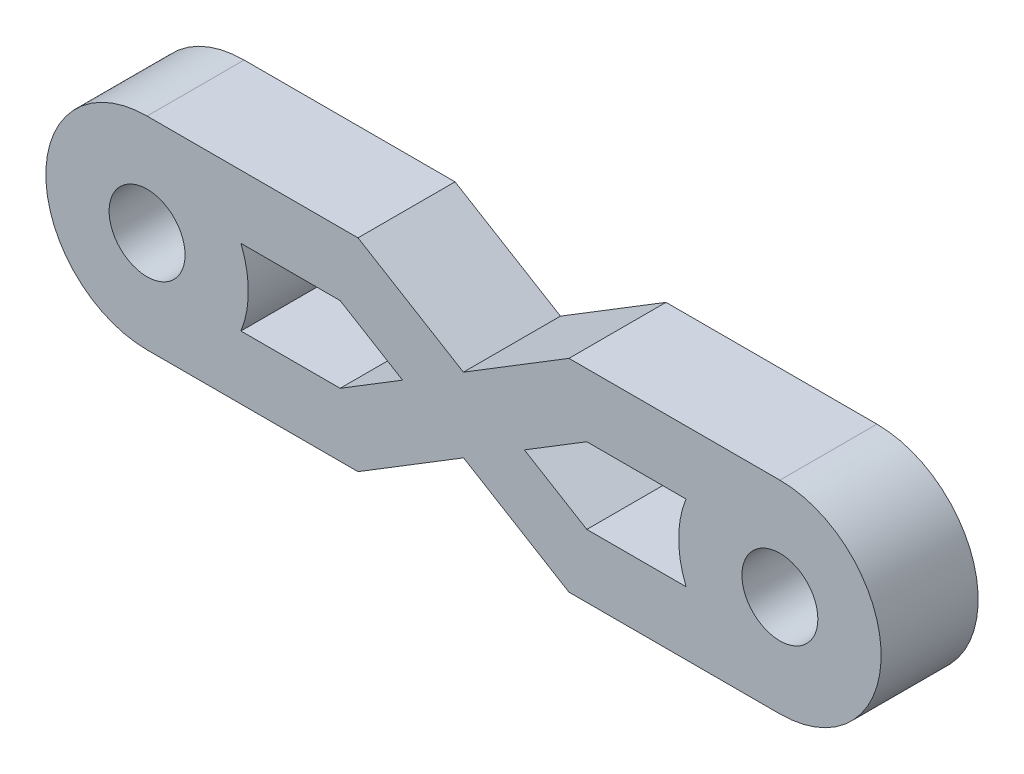
ISO-10303-21;
HEADER;
FILE_DESCRIPTION(('STEP AP214'),'2;1');
FILE_NAME('part.step','',(''),(''),'','','');
FILE_SCHEMA(('AUTOMOTIVE_DESIGN { 1 0 10303 214 1 1 1 1 }'));
ENDSEC;
DATA;
#1=APPLICATION_CONTEXT('core data for automotive mechanical design processes');
#2=APPLICATION_PROTOCOL_DEFINITION('international standard','automotive_design',2000,#1);
#3=PRODUCT_CONTEXT('',#1,'mechanical');
#4=PRODUCT('Part','Part','',(#3));
#5=PRODUCT_RELATED_PRODUCT_CATEGORY('part','',(#4));
#6=PRODUCT_DEFINITION_FORMATION('','',#4);
#7=PRODUCT_DEFINITION_CONTEXT('part definition',#1,'design');
#8=PRODUCT_DEFINITION('design','',#6,#7);
#9=PRODUCT_DEFINITION_SHAPE('','',#8);
#10=(LENGTH_UNIT() NAMED_UNIT(*) SI_UNIT(.MILLI.,.METRE.));
#11=(NAMED_UNIT(*) PLANE_ANGLE_UNIT() SI_UNIT($,.RADIAN.));
#12=(NAMED_UNIT(*) SI_UNIT($,.STERADIAN.) SOLID_ANGLE_UNIT());
#13=UNCERTAINTY_MEASURE_WITH_UNIT(LENGTH_MEASURE(1.E-05),#10,'distance_accuracy_value','');
#14=(GEOMETRIC_REPRESENTATION_CONTEXT(3) GLOBAL_UNCERTAINTY_ASSIGNED_CONTEXT((#13)) GLOBAL_UNIT_ASSIGNED_CONTEXT((#10,
#11,#12)) REPRESENTATION_CONTEXT('',''));
#15=CARTESIAN_POINT('',(0.,0.,0.));
#16=DIRECTION('',(0.,0.,1.));
#17=DIRECTION('',(1.,0.,0.));
#18=AXIS2_PLACEMENT_3D('',#15,#16,#17);
#19=CARTESIAN_POINT('',(-117.224103079449,-0.0523282381606968,45.3592960120693));
#20=DIRECTION('',(0.,0.,-1.));
#21=DIRECTION('',(-1.,0.,0.));
#22=AXIS2_PLACEMENT_3D('',#19,#20,#21);
#23=CYLINDRICAL_SURFACE('',#22,4.79999999999999);
#24=CARTESIAN_POINT('',(-117.224103079449,-0.0523282381606968,4.5999999995309));
#25=DIRECTION('',(2.71474370928103E-13,3.35516105467142E-13,1.));
#26=DIRECTION('',(0.,-1.,3.35516105467142E-13));
#27=AXIS2_PLACEMENT_3D('',#24,#25,#26);
#28=CIRCLE('',#27,4.79999999999999);
#29=CARTESIAN_POINT('',(-112.774383987193,-1.85232823816272,4.59999999953029));
#30=VERTEX_POINT('',#29);
#31=CARTESIAN_POINT('',(-112.774383987192,1.74767176183929,4.59999999952909));
#32=VERTEX_POINT('',#31);
#33=EDGE_CURVE('E223',#30,#32,#28,.T.);
#34=ORIENTED_EDGE('',*,*,#33,.F.);
#35=DIRECTION('',(0.,0.,-1.));
#36=VECTOR('',#35,1.);
#37=CARTESIAN_POINT('',(-112.774383987193,-1.8523282381628,45.3592960120693));
#38=LINE('',#37,#36);
#39=CARTESIAN_POINT('',(-112.774383987193,-1.8523282381628,0.));
#40=VERTEX_POINT('',#39);
#41=EDGE_CURVE('E186',#30,#40,#38,.T.);
#42=ORIENTED_EDGE('',*,*,#41,.T.);
#43=CARTESIAN_POINT('',(-117.224103079449,-0.0523282381606968,0.));
#44=DIRECTION('',(0.,0.,1.));
#45=DIRECTION('',(1.,0.,0.));
#46=AXIS2_PLACEMENT_3D('',#43,#44,#45);
#47=CIRCLE('',#46,4.79999999999999);
#48=CARTESIAN_POINT('',(-112.774383987192,1.74767176183928,0.));
#49=VERTEX_POINT('',#48);
#50=EDGE_CURVE('E188',#40,#49,#47,.T.);
#51=ORIENTED_EDGE('',*,*,#50,.T.);
#52=DIRECTION('',(0.,0.,-1.));
#53=VECTOR('',#52,1.);
#54=CARTESIAN_POINT('',(-112.774383987192,1.74767176183928,45.3592960120693));
#55=LINE('',#54,#53);
#56=EDGE_CURVE('E173',#32,#49,#55,.T.);
#57=ORIENTED_EDGE('',*,*,#56,.F.);
#58=EDGE_LOOP('',(#34,#42,#51,#57));
#59=FACE_BOUND('',#58,.T.);
#60=ADVANCED_FACE('F41',(#59),#23,.T.);
#61=CARTESIAN_POINT('',(0.,1.74767176183902,45.3592960120693));
#62=DIRECTION('',(0.,-1.,0.));
#63=DIRECTION('',(1.,0.,0.));
#64=AXIS2_PLACEMENT_3D('',#61,#62,#63);
#65=PLANE('',#64);
#66=DIRECTION('',(0.,0.,-1.));
#67=VECTOR('',#66,1.);
#68=CARTESIAN_POINT('',(-108.070776900008,1.74767176183927,45.3592960120693));
#69=LINE('',#68,#67);
#70=CARTESIAN_POINT('',(-108.070776900008,1.74767176183928,4.59999999952781));
#71=VERTEX_POINT('',#70);
#72=CARTESIAN_POINT('',(-108.070776900008,1.74767176183927,0.));
#73=VERTEX_POINT('',#72);
#74=EDGE_CURVE('E177',#71,#73,#69,.T.);
#75=ORIENTED_EDGE('',*,*,#74,.F.);
#76=DIRECTION('',(-1.,0.,2.71474370928102E-13));
#77=VECTOR('',#76,1.);
#78=CARTESIAN_POINT('',(-1.10609952148072E-11,1.74767176183902,4.59999999949847));
#79=LINE('',#78,#77);
#80=EDGE_CURVE('E176',#71,#32,#79,.T.);
#81=ORIENTED_EDGE('',*,*,#80,.T.);
#82=ORIENTED_EDGE('',*,*,#56,.T.);
#83=DIRECTION('',(-1.,0.,0.));
#84=VECTOR('',#83,1.);
#85=CARTESIAN_POINT('',(0.,1.74767176183902,0.));
#86=LINE('',#85,#84);
#87=EDGE_CURVE('E260',#73,#49,#86,.T.);
#88=ORIENTED_EDGE('',*,*,#87,.F.);
#89=EDGE_LOOP('',(#75,#81,#82,#88));
#90=FACE_BOUND('',#89,.T.);
#91=ADVANCED_FACE('F327',(#90),#65,.T.);
#92=CARTESIAN_POINT('',(-28.0905239850138,-46.5334504997929,45.3592960120693));
#93=DIRECTION('',(-0.516799739316125,-0.856106319006457,0.));
#94=DIRECTION('',(0.856106319006457,-0.516799739316125,0.));
#95=AXIS2_PLACEMENT_3D('',#92,#93,#94);
#96=PLANE('',#95);
#97=DIRECTION('',(0.,0.,-1.));
#98=VECTOR('',#97,1.);
#99=CARTESIAN_POINT('',(-105.112622172867,-0.0380569004809553,45.3592960120693));
#100=LINE('',#99,#98);
#101=CARTESIAN_POINT('',(-105.112622172867,-0.0380569004809483,4.5999999995276));
#102=VERTEX_POINT('',#101);
#103=CARTESIAN_POINT('',(-105.112622172867,-0.0380569004809553,0.));
#104=VERTEX_POINT('',#103);
#105=EDGE_CURVE('E179',#102,#104,#100,.T.);
#106=ORIENTED_EDGE('',*,*,#105,.F.);
#107=DIRECTION('',(-0.856106319006457,0.516799739316125,0.));
#108=VECTOR('',#107,1.);
#109=CARTESIAN_POINT('',(-28.0905239850159,-46.5334504997916,4.59999999952229));
#110=LINE('',#109,#108);
#111=EDGE_CURVE('E175',#102,#71,#110,.T.);
#112=ORIENTED_EDGE('',*,*,#111,.T.);
#113=ORIENTED_EDGE('',*,*,#74,.T.);
#114=DIRECTION('',(-0.856106319006457,0.516799739316125,0.));
#115=VECTOR('',#114,1.);
#116=CARTESIAN_POINT('',(-28.0905239850138,-46.5334504997929,0.));
#117=LINE('',#116,#115);
#118=EDGE_CURVE('E293',#104,#73,#117,.T.);
#119=ORIENTED_EDGE('',*,*,#118,.F.);
#120=EDGE_LOOP('',(#106,#112,#113,#119));
#121=FACE_BOUND('',#120,.T.);
#122=ADVANCED_FACE('F339',(#121),#96,.T.);
#123=CARTESIAN_POINT('',(-28.7140795996481,46.8180743084317,45.3592960120693));
#124=DIRECTION('',(0.522815243854154,-0.852446022217079,0.));
#125=DIRECTION('',(0.852446022217079,0.522815243854154,0.));
#126=AXIS2_PLACEMENT_3D('',#123,#124,#125);
#127=PLANE('',#126);
#128=DIRECTION('',(-0.852446022217079,-0.522815243854154,4.06830182128346E-13));
#129=VECTOR('',#128,1.);
#130=CARTESIAN_POINT('',(-28.7140795996623,46.8180743084231,4.59999999949114));
#131=LINE('',#130,#129);
#132=CARTESIAN_POINT('',(-108.070776900009,-1.85232823816272,4.59999999952965));
#133=VERTEX_POINT('',#132);
#134=EDGE_CURVE('E51',#102,#133,#131,.T.);
#135=ORIENTED_EDGE('',*,*,#134,.F.);
#136=ORIENTED_EDGE('',*,*,#105,.T.);
#137=DIRECTION('',(-0.852446022217079,-0.522815243854154,0.));
#138=VECTOR('',#137,1.);
#139=CARTESIAN_POINT('',(-28.7140795996481,46.8180743084317,0.));
#140=LINE('',#139,#138);
#141=CARTESIAN_POINT('',(-108.070776900009,-1.85232823816272,0.));
#142=VERTEX_POINT('',#141);
#143=EDGE_CURVE('E181',#104,#142,#140,.T.);
#144=ORIENTED_EDGE('',*,*,#143,.T.);
#145=DIRECTION('',(0.,0.,-1.));
#146=VECTOR('',#145,1.);
#147=CARTESIAN_POINT('',(-108.070776900009,-1.85232823816272,45.3592960120693));
#148=LINE('',#147,#146);
#149=EDGE_CURVE('E182',#133,#142,#148,.T.);
#150=ORIENTED_EDGE('',*,*,#149,.F.);
#151=EDGE_LOOP('',(#135,#136,#144,#150));
#152=FACE_BOUND('',#151,.T.);
#153=ADVANCED_FACE('F342',(#152),#127,.F.);
#154=CARTESIAN_POINT('',(0.,4.74767176183923,45.3592960120693));
#155=DIRECTION('',(0.,1.,0.));
#156=DIRECTION('',(-1.,0.,0.));
#157=AXIS2_PLACEMENT_3D('',#154,#155,#156);
#158=PLANE('',#157);
#159=DIRECTION('',(0.,0.,-1.));
#160=VECTOR('',#159,1.);
#161=CARTESIAN_POINT('',(-117.224103079449,4.74767176183929,45.3592960120693));
#162=LINE('',#161,#160);
#163=CARTESIAN_POINT('',(-117.224103079449,4.74767176183929,4.59999999952929));
#164=VERTEX_POINT('',#163);
#165=CARTESIAN_POINT('',(-117.224103079449,4.74767176183929,0.));
#166=VERTEX_POINT('',#165);
#167=EDGE_CURVE('E189',#164,#166,#162,.T.);
#168=ORIENTED_EDGE('',*,*,#167,.F.);
#169=DIRECTION('',(1.,0.,-2.71474370928103E-13));
#170=VECTOR('',#169,1.);
#171=CARTESIAN_POINT('',(-1.10626334789455E-11,4.74767176183923,4.59999999949746));
#172=LINE('',#171,#170);
#173=CARTESIAN_POINT('',(-107.224087866829,4.74767176183929,4.59999999952657));
#174=VERTEX_POINT('',#173);
#175=EDGE_CURVE('E216',#164,#174,#172,.T.);
#176=ORIENTED_EDGE('',*,*,#175,.T.);
#177=DIRECTION('',(0.,0.,-1.));
#178=VECTOR('',#177,1.);
#179=CARTESIAN_POINT('',(-107.224087866829,4.74767176183928,45.3592960120693));
#180=LINE('',#179,#178);
#181=CARTESIAN_POINT('',(-107.224087866829,4.74767176183928,0.));
#182=VERTEX_POINT('',#181);
#183=EDGE_CURVE('E192',#174,#182,#180,.T.);
#184=ORIENTED_EDGE('',*,*,#183,.T.);
#185=DIRECTION('',(1.,0.,0.));
#186=VECTOR('',#185,1.);
#187=CARTESIAN_POINT('',(0.,4.74767176183923,0.));
#188=LINE('',#187,#186);
#189=EDGE_CURVE('E283',#166,#182,#188,.T.);
#190=ORIENTED_EDGE('',*,*,#189,.F.);
#191=EDGE_LOOP('',(#168,#176,#184,#190));
#192=FACE_BOUND('',#191,.T.);
#193=ADVANCED_FACE('F344',(#192),#158,.T.);
#194=CARTESIAN_POINT('',(-117.224103079449,-0.0523282381606968,4.5999999995309));
#195=DIRECTION('',(2.71474370928103E-13,3.35516105467142E-13,1.));
#196=DIRECTION('',(0.,-1.,3.35516105467142E-13));
#197=AXIS2_PLACEMENT_3D('',#194,#195,#196);
#198=CIRCLE('',#197,4.79999999999999);
#199=CARTESIAN_POINT('',(-117.224103079449,-4.85232823816068,4.59999999953251));
#200=VERTEX_POINT('',#199);
#201=EDGE_CURVE('E233',#164,#200,#198,.T.);
#202=ORIENTED_EDGE('',*,*,#201,.F.);
#203=ORIENTED_EDGE('',*,*,#167,.T.);
#204=CARTESIAN_POINT('',(-117.224103079449,-4.85232823816068,0.));
#205=VERTEX_POINT('',#204);
#206=EDGE_CURVE('E191',#166,#205,#47,.T.);
#207=ORIENTED_EDGE('',*,*,#206,.T.);
#208=DIRECTION('',(0.,0.,-1.));
#209=VECTOR('',#208,1.);
#210=CARTESIAN_POINT('',(-117.224103079449,-4.85232823816068,45.3592960120693));
#211=LINE('',#210,#209);
#212=EDGE_CURVE('E193',#200,#205,#211,.T.);
#213=ORIENTED_EDGE('',*,*,#212,.F.);
#214=EDGE_LOOP('',(#202,#203,#207,#213));
#215=FACE_BOUND('',#214,.T.);
#216=ADVANCED_FACE('F350',(#215),#23,.T.);
#217=CARTESIAN_POINT('',(0.,-4.85232823816062,45.3592960120693));
#218=DIRECTION('',(0.,1.,0.));
#219=DIRECTION('',(-1.,0.,0.));
#220=AXIS2_PLACEMENT_3D('',#217,#218,#219);
#221=PLANE('',#220);
#222=DIRECTION('',(1.,0.,-2.71474370928103E-13));
#223=VECTOR('',#222,1.);
#224=CARTESIAN_POINT('',(-1.10625790140136E-11,-4.85232823816062,4.59999999950068));
#225=LINE('',#224,#223);
#226=CARTESIAN_POINT('',(-107.224087866829,-4.85232823816068,4.59999999952979));
#227=VERTEX_POINT('',#226);
#228=EDGE_CURVE('E236',#200,#227,#225,.T.);
#229=ORIENTED_EDGE('',*,*,#228,.F.);
#230=ORIENTED_EDGE('',*,*,#212,.T.);
#231=DIRECTION('',(1.,0.,0.));
#232=VECTOR('',#231,1.);
#233=CARTESIAN_POINT('',(0.,-4.85232823816062,0.));
#234=LINE('',#233,#232);
#235=CARTESIAN_POINT('',(-107.224087866829,-4.85232823816068,0.));
#236=VERTEX_POINT('',#235);
#237=EDGE_CURVE('E195',#205,#236,#234,.T.);
#238=ORIENTED_EDGE('',*,*,#237,.T.);
#239=DIRECTION('',(0.,0.,-1.));
#240=VECTOR('',#239,1.);
#241=CARTESIAN_POINT('',(-107.224087866829,-4.85232823816068,45.3592960120693));
#242=LINE('',#241,#240);
#243=EDGE_CURVE('E196',#227,#236,#242,.T.);
#244=ORIENTED_EDGE('',*,*,#243,.F.);
#245=EDGE_LOOP('',(#229,#230,#238,#244));
#246=FACE_BOUND('',#245,.T.);
#247=ADVANCED_FACE('F363',(#246),#221,.F.);
#248=CARTESIAN_POINT('',(-27.1456338680857,44.2607362417805,45.3592960120693));
#249=DIRECTION('',(-0.522815243854155,0.852446022217079,0.));
#250=DIRECTION('',(-0.852446022217079,-0.522815243854155,0.));
#251=AXIS2_PLACEMENT_3D('',#248,#249,#250);
#252=PLANE('',#251);
#253=DIRECTION('',(0.852446022217079,0.522815243854155,-4.06830182128346E-13));
#254=VECTOR('',#253,1.);
#255=CARTESIAN_POINT('',(-27.1456338680999,44.2607362417718,4.59999999949157));
#256=LINE('',#255,#254);
#257=CARTESIAN_POINT('',(-102.220792221133,-1.78374774754404,4.5999999995274));
#258=VERTEX_POINT('',#257);
#259=EDGE_CURVE('E240',#227,#258,#256,.T.);
#260=ORIENTED_EDGE('',*,*,#259,.F.);
#261=ORIENTED_EDGE('',*,*,#243,.T.);
#262=DIRECTION('',(0.852446022217079,0.522815243854155,0.));
#263=VECTOR('',#262,1.);
#264=CARTESIAN_POINT('',(-27.1456338680857,44.2607362417805,0.));
#265=LINE('',#264,#263);
#266=CARTESIAN_POINT('',(-102.220792221133,-1.78374774754406,0.));
#267=VERTEX_POINT('',#266);
#268=EDGE_CURVE('E198',#236,#267,#265,.T.);
#269=ORIENTED_EDGE('',*,*,#268,.T.);
#270=DIRECTION('',(0.,0.,-1.));
#271=VECTOR('',#270,1.);
#272=CARTESIAN_POINT('',(-102.220792221133,-1.78374774754406,45.3592960120693));
#273=LINE('',#272,#271);
#274=EDGE_CURVE('E199',#258,#267,#273,.T.);
#275=ORIENTED_EDGE('',*,*,#274,.F.);
#276=EDGE_LOOP('',(#260,#261,#269,#275));
#277=FACE_BOUND('',#276,.T.);
#278=ADVANCED_FACE('F368',(#277),#252,.F.);
#279=CARTESIAN_POINT('',(-28.0905239850139,-46.5334504997929,45.3592960120693));
#280=DIRECTION('',(-0.516799739316126,-0.856106319006456,0.));
#281=DIRECTION('',(0.856106319006456,-0.516799739316126,0.));
#282=AXIS2_PLACEMENT_3D('',#279,#280,#281);
#283=PLANE('',#282);
#284=DIRECTION('',(0.,0.,-1.));
#285=VECTOR('',#284,1.);
#286=CARTESIAN_POINT('',(-97.2242095671638,-4.79999999999741,45.3592960120693));
#287=LINE('',#286,#285);
#288=CARTESIAN_POINT('',(-97.2242095671638,-4.79999999999741,4.59999999952706));
#289=VERTEX_POINT('',#288);
#290=CARTESIAN_POINT('',(-97.2242095671638,-4.79999999999741,0.));
#291=VERTEX_POINT('',#290);
#292=EDGE_CURVE('E203',#289,#291,#287,.T.);
#293=ORIENTED_EDGE('',*,*,#292,.F.);
#294=DIRECTION('',(-0.856106319006456,0.516799739316126,0.));
#295=VECTOR('',#294,1.);
#296=CARTESIAN_POINT('',(-28.090523985016,-46.5334504997917,4.59999999952229));
#297=LINE('',#296,#295);
#298=EDGE_CURVE('E202',#289,#258,#297,.T.);
#299=ORIENTED_EDGE('',*,*,#298,.T.);
#300=ORIENTED_EDGE('',*,*,#274,.T.);
#301=DIRECTION('',(-0.856106319006456,0.516799739316126,0.));
#302=VECTOR('',#301,1.);
#303=CARTESIAN_POINT('',(-28.0905239850139,-46.5334504997929,0.));
#304=LINE('',#303,#302);
#305=EDGE_CURVE('E290',#291,#267,#304,.T.);
#306=ORIENTED_EDGE('',*,*,#305,.F.);
#307=EDGE_LOOP('',(#293,#299,#300,#306));
#308=FACE_BOUND('',#307,.T.);
#309=ADVANCED_FACE('F445',(#308),#283,.T.);
#310=CARTESIAN_POINT('',(0.,-4.79999999999741,45.3592960120693));
#311=DIRECTION('',(0.,-1.,0.));
#312=DIRECTION('',(0.,0.,-1.));
#313=AXIS2_PLACEMENT_3D('',#310,#311,#312);
#314=PLANE('',#313);
#315=DIRECTION('',(0.,0.,-1.));
#316=VECTOR('',#315,1.);
#317=CARTESIAN_POINT('',(-87.2241943545439,-4.79999999999741,45.3592960120693));
#318=LINE('',#317,#316);
#319=CARTESIAN_POINT('',(-87.2241943545439,-4.79999999999741,4.59999999952435));
#320=VERTEX_POINT('',#319);
#321=CARTESIAN_POINT('',(-87.2241943545439,-4.79999999999741,0.));
#322=VERTEX_POINT('',#321);
#323=EDGE_CURVE('E205',#320,#322,#318,.T.);
#324=ORIENTED_EDGE('',*,*,#323,.F.);
#325=DIRECTION('',(-1.,0.,2.71474370928103E-13));
#326=VECTOR('',#325,1.);
#327=CARTESIAN_POINT('',(-1.10651042444844E-11,-4.79999999999741,4.59999999950067));
#328=LINE('',#327,#326);
#329=EDGE_CURVE('E201',#320,#289,#328,.T.);
#330=ORIENTED_EDGE('',*,*,#329,.T.);
#331=ORIENTED_EDGE('',*,*,#292,.T.);
#332=DIRECTION('',(-1.,0.,0.));
#333=VECTOR('',#332,1.);
#334=CARTESIAN_POINT('',(0.,-4.79999999999741,0.));
#335=LINE('',#334,#333);
#336=EDGE_CURVE('E282',#322,#291,#335,.T.);
#337=ORIENTED_EDGE('',*,*,#336,.F.);
#338=EDGE_LOOP('',(#324,#330,#331,#337));
#339=FACE_BOUND('',#338,.T.);
#340=ADVANCED_FACE('F449',(#339),#314,.T.);
#341=CARTESIAN_POINT('',(-87.2241943545439,2.57432963834958E-12,45.3592960120693));
#342=DIRECTION('',(0.,0.,-1.));
#343=DIRECTION('',(-1.,0.,0.));
#344=AXIS2_PLACEMENT_3D('',#341,#342,#343);
#345=CYLINDRICAL_SURFACE('',#344,4.79999999999999);
#346=CARTESIAN_POINT('',(-87.2241943545439,2.57432963834958E-12,4.59999999952274));
#347=DIRECTION('',(2.71474370928103E-13,3.35516105467142E-13,1.));
#348=DIRECTION('',(0.,-1.,3.35516105467142E-13));
#349=AXIS2_PLACEMENT_3D('',#346,#347,#348);
#350=CIRCLE('',#349,4.79999999999999);
#351=CARTESIAN_POINT('',(-87.2241943545439,4.79999999999741,4.59999999952112));
#352=VERTEX_POINT('',#351);
#353=EDGE_CURVE('E243',#320,#352,#350,.T.);
#354=ORIENTED_EDGE('',*,*,#353,.F.);
#355=ORIENTED_EDGE('',*,*,#323,.T.);
#356=CARTESIAN_POINT('',(-87.2241943545439,2.57432963834958E-12,0.));
#357=DIRECTION('',(0.,0.,1.));
#358=DIRECTION('',(1.,0.,0.));
#359=AXIS2_PLACEMENT_3D('',#356,#357,#358);
#360=CIRCLE('',#359,4.79999999999999);
#361=CARTESIAN_POINT('',(-87.2241943545439,4.79999999999998,0.));
#362=VERTEX_POINT('',#361);
#363=EDGE_CURVE('E163',#322,#362,#360,.T.);
#364=ORIENTED_EDGE('',*,*,#363,.T.);
#365=DIRECTION('',(0.,0.,-1.));
#366=VECTOR('',#365,1.);
#367=CARTESIAN_POINT('',(-87.2241943545439,4.79999999999998,45.3592960120693));
#368=LINE('',#367,#366);
#369=EDGE_CURVE('E207',#352,#362,#368,.T.);
#370=ORIENTED_EDGE('',*,*,#369,.F.);
#371=EDGE_LOOP('',(#354,#355,#364,#370));
#372=FACE_BOUND('',#371,.T.);
#373=ADVANCED_FACE('F421',(#372),#345,.T.);
#374=CARTESIAN_POINT('',(0.,4.79999999999741,45.3592960120693));
#375=DIRECTION('',(0.,-1.,0.));
#376=DIRECTION('',(0.,0.,-1.));
#377=AXIS2_PLACEMENT_3D('',#374,#375,#376);
#378=PLANE('',#377);
#379=DIRECTION('',(-1.,0.,2.71474370928103E-13));
#380=VECTOR('',#379,1.);
#381=CARTESIAN_POINT('',(-1.10651042444853E-11,4.79999999999741,4.59999999949744));
#382=LINE('',#381,#380);
#383=CARTESIAN_POINT('',(-97.2242095671638,4.79999999999741,4.59999999952384));
#384=VERTEX_POINT('',#383);
#385=EDGE_CURVE('E250',#352,#384,#382,.T.);
#386=ORIENTED_EDGE('',*,*,#385,.F.);
#387=ORIENTED_EDGE('',*,*,#369,.T.);
#388=DIRECTION('',(-1.,0.,0.));
#389=VECTOR('',#388,1.);
#390=CARTESIAN_POINT('',(0.,4.79999999999741,0.));
#391=LINE('',#390,#389);
#392=CARTESIAN_POINT('',(-97.2242095671638,4.79999999999741,0.));
#393=VERTEX_POINT('',#392);
#394=EDGE_CURVE('E209',#362,#393,#391,.T.);
#395=ORIENTED_EDGE('',*,*,#394,.T.);
#396=DIRECTION('',(0.,0.,-1.));
#397=VECTOR('',#396,1.);
#398=CARTESIAN_POINT('',(-97.2242095671638,4.79999999999741,45.3592960120693));
#399=LINE('',#398,#397);
#400=EDGE_CURVE('E210',#384,#393,#399,.T.);
#401=ORIENTED_EDGE('',*,*,#400,.F.);
#402=EDGE_LOOP('',(#386,#387,#395,#401));
#403=FACE_BOUND('',#402,.T.);
#404=ADVANCED_FACE('F455',(#403),#378,.F.);
#405=CARTESIAN_POINT('',(-28.7140795996482,46.8180743084318,45.3592960120693));
#406=DIRECTION('',(0.522815243854155,-0.852446022217079,0.));
#407=DIRECTION('',(0.852446022217079,0.522815243854155,0.));
#408=AXIS2_PLACEMENT_3D('',#405,#406,#407);
#409=PLANE('',#408);
#410=DIRECTION('',(-0.852446022217079,-0.522815243854155,4.06830182128346E-13));
#411=VECTOR('',#410,1.);
#412=CARTESIAN_POINT('',(-28.7140795996624,46.8180743084231,4.59999999949114));
#413=LINE('',#412,#411);
#414=CARTESIAN_POINT('',(-102.227505212856,1.73141950938336,4.5999999995264));
#415=VERTEX_POINT('',#414);
#416=EDGE_CURVE('E225',#384,#415,#413,.T.);
#417=ORIENTED_EDGE('',*,*,#416,.F.);
#418=ORIENTED_EDGE('',*,*,#400,.T.);
#419=DIRECTION('',(-0.852446022217079,-0.522815243854155,0.));
#420=VECTOR('',#419,1.);
#421=CARTESIAN_POINT('',(-28.7140795996482,46.8180743084318,0.));
#422=LINE('',#421,#420);
#423=CARTESIAN_POINT('',(-102.227505212856,1.73141950938336,0.));
#424=VERTEX_POINT('',#423);
#425=EDGE_CURVE('E169',#393,#424,#422,.T.);
#426=ORIENTED_EDGE('',*,*,#425,.T.);
#427=DIRECTION('',(0.,0.,-1.));
#428=VECTOR('',#427,1.);
#429=CARTESIAN_POINT('',(-102.227505212856,1.73141950938336,45.3592960120693));
#430=LINE('',#429,#428);
#431=EDGE_CURVE('E212',#415,#424,#430,.T.);
#432=ORIENTED_EDGE('',*,*,#431,.F.);
#433=EDGE_LOOP('',(#417,#418,#426,#432));
#434=FACE_BOUND('',#433,.T.);
#435=ADVANCED_FACE('F425',(#434),#409,.F.);
#436=CARTESIAN_POINT('',(0.,1.79999999999743,45.3592960120693));
#437=DIRECTION('',(0.,1.,0.));
#438=DIRECTION('',(-1.,0.,0.));
#439=AXIS2_PLACEMENT_3D('',#436,#437,#438);
#440=PLANE('',#439);
#441=DIRECTION('',(1.,0.,-2.71474370928103E-13));
#442=VECTOR('',#441,1.);
#443=CARTESIAN_POINT('',(-1.10656021340088E-11,1.79999999999743,4.59999999949845));
#444=LINE('',#443,#442);
#445=CARTESIAN_POINT('',(-96.3775205339874,1.79999999999741,4.59999999952461));
#446=VERTEX_POINT('',#445);
#447=CARTESIAN_POINT('',(-91.6739134468034,1.79999999999741,4.59999999952334));
#448=VERTEX_POINT('',#447);
#449=EDGE_CURVE('E257',#446,#448,#444,.T.);
#450=ORIENTED_EDGE('',*,*,#449,.F.);
#451=DIRECTION('',(0.,0.,-1.));
#452=VECTOR('',#451,1.);
#453=CARTESIAN_POINT('',(-96.3775205339874,1.79999999999741,45.3592960120693));
#454=LINE('',#453,#452);
#455=CARTESIAN_POINT('',(-96.3775205339874,1.79999999999741,0.));
#456=VERTEX_POINT('',#455);
#457=EDGE_CURVE('E166',#446,#456,#454,.T.);
#458=ORIENTED_EDGE('',*,*,#457,.T.);
#459=DIRECTION('',(1.,0.,0.));
#460=VECTOR('',#459,1.);
#461=CARTESIAN_POINT('',(0.,1.79999999999743,0.));
#462=LINE('',#461,#460);
#463=CARTESIAN_POINT('',(-91.6739134468034,1.79999999999741,0.));
#464=VERTEX_POINT('',#463);
#465=EDGE_CURVE('E152',#456,#464,#462,.T.);
#466=ORIENTED_EDGE('',*,*,#465,.T.);
#467=DIRECTION('',(0.,0.,-1.));
#468=VECTOR('',#467,1.);
#469=CARTESIAN_POINT('',(-91.6739134468034,1.79999999999741,45.3592960120693));
#470=LINE('',#469,#468);
#471=EDGE_CURVE('E142',#448,#464,#470,.T.);
#472=ORIENTED_EDGE('',*,*,#471,.F.);
#473=EDGE_LOOP('',(#450,#458,#466,#472));
#474=FACE_BOUND('',#473,.T.);
#475=ADVANCED_FACE('F164',(#474),#440,.F.);
#476=CARTESIAN_POINT('',(-87.2241943545439,2.57432963834958E-12,4.59999999952274));
#477=DIRECTION('',(2.71474370928103E-13,3.35516105467142E-13,1.));
#478=DIRECTION('',(0.,-1.,3.35516105467142E-13));
#479=AXIS2_PLACEMENT_3D('',#476,#477,#478);
#480=CIRCLE('',#479,4.79999999999999);
#481=CARTESIAN_POINT('',(-91.6739134468013,-1.79999999999741,4.59999999952454));
#482=VERTEX_POINT('',#481);
#483=EDGE_CURVE('E148',#448,#482,#480,.T.);
#484=ORIENTED_EDGE('',*,*,#483,.F.);
#485=ORIENTED_EDGE('',*,*,#471,.T.);
#486=CARTESIAN_POINT('',(-91.6739134468013,-1.79999999999741,0.));
#487=VERTEX_POINT('',#486);
#488=EDGE_CURVE('E145',#464,#487,#360,.T.);
#489=ORIENTED_EDGE('',*,*,#488,.T.);
#490=DIRECTION('',(0.,0.,-1.));
#491=VECTOR('',#490,1.);
#492=CARTESIAN_POINT('',(-91.6739134468013,-1.79999999999741,45.3592960120693));
#493=LINE('',#492,#491);
#494=EDGE_CURVE('E136',#482,#487,#493,.T.);
#495=ORIENTED_EDGE('',*,*,#494,.F.);
#496=EDGE_LOOP('',(#484,#485,#489,#495));
#497=FACE_BOUND('',#496,.T.);
#498=ADVANCED_FACE('F144',(#497),#345,.T.);
#499=CARTESIAN_POINT('',(0.,-1.7999999999974,45.3592960120693));
#500=DIRECTION('',(0.,1.,0.));
#501=DIRECTION('',(-1.,0.,0.));
#502=AXIS2_PLACEMENT_3D('',#499,#500,#501);
#503=PLANE('',#502);
#504=DIRECTION('',(0.,0.,-1.));
#505=VECTOR('',#504,1.);
#506=CARTESIAN_POINT('',(-96.3775205339853,-1.79999999999741,45.3592960120693));
#507=LINE('',#506,#505);
#508=CARTESIAN_POINT('',(-96.3775205339853,-1.79999999999741,4.59999999952582));
#509=VERTEX_POINT('',#508);
#510=CARTESIAN_POINT('',(-96.3775205339853,-1.79999999999741,0.));
#511=VERTEX_POINT('',#510);
#512=EDGE_CURVE('E185',#509,#511,#507,.T.);
#513=ORIENTED_EDGE('',*,*,#512,.F.);
#514=DIRECTION('',(1.,0.,-2.71474370928103E-13));
#515=VECTOR('',#514,1.);
#516=CARTESIAN_POINT('',(-1.10649382813101E-11,-1.7999999999974,4.59999999949966));
#517=LINE('',#516,#515);
#518=EDGE_CURVE('E161',#509,#482,#517,.T.);
#519=ORIENTED_EDGE('',*,*,#518,.T.);
#520=ORIENTED_EDGE('',*,*,#494,.T.);
#521=DIRECTION('',(1.,0.,0.));
#522=VECTOR('',#521,1.);
#523=CARTESIAN_POINT('',(0.,-1.7999999999974,0.));
#524=LINE('',#523,#522);
#525=EDGE_CURVE('E160',#511,#487,#524,.T.);
#526=ORIENTED_EDGE('',*,*,#525,.F.);
#527=EDGE_LOOP('',(#513,#519,#520,#526));
#528=FACE_BOUND('',#527,.T.);
#529=ADVANCED_FACE('F412',(#528),#503,.T.);
#530=CARTESIAN_POINT('',(-26.5370820421153,-43.9600911066842,45.3592960120693));
#531=DIRECTION('',(0.516799739316127,0.856106319006456,0.));
#532=DIRECTION('',(-0.856106319006456,0.516799739316127,0.));
#533=AXIS2_PLACEMENT_3D('',#530,#531,#532);
#534=PLANE('',#533);
#535=DIRECTION('',(0.,0.,-1.));
#536=VECTOR('',#535,1.);
#537=CARTESIAN_POINT('',(-99.3356752611222,-0.0142713376797138,45.3592960120693));
#538=LINE('',#537,#536);
#539=CARTESIAN_POINT('',(-99.3356752611222,-0.0142713376797138,4.59999999952532));
#540=VERTEX_POINT('',#539);
#541=CARTESIAN_POINT('',(-99.3356752611222,-0.0142713376797138,0.));
#542=VERTEX_POINT('',#541);
#543=EDGE_CURVE('E214',#540,#542,#538,.T.);
#544=ORIENTED_EDGE('',*,*,#543,.F.);
#545=DIRECTION('',(0.856106319006456,-0.516799739316127,0.));
#546=VECTOR('',#545,1.);
#547=CARTESIAN_POINT('',(-26.5370820421173,-43.960091106683,4.59999999952101));
#548=LINE('',#547,#546);
#549=EDGE_CURVE('E219',#540,#509,#548,.T.);
#550=ORIENTED_EDGE('',*,*,#549,.T.);
#551=ORIENTED_EDGE('',*,*,#512,.T.);
#552=DIRECTION('',(0.856106319006456,-0.516799739316127,0.));
#553=VECTOR('',#552,1.);
#554=CARTESIAN_POINT('',(-26.5370820421153,-43.9600911066842,0.));
#555=LINE('',#554,#553);
#556=EDGE_CURVE('E304',#542,#511,#555,.T.);
#557=ORIENTED_EDGE('',*,*,#556,.F.);
#558=EDGE_LOOP('',(#544,#550,#551,#557));
#559=FACE_BOUND('',#558,.T.);
#560=ADVANCED_FACE('F410',(#559),#534,.T.);
#561=CARTESIAN_POINT('',(0.,-1.85232823816272,45.3592960120693));
#562=DIRECTION('',(0.,-1.,0.));
#563=DIRECTION('',(0.,0.,-1.));
#564=AXIS2_PLACEMENT_3D('',#561,#562,#563);
#565=PLANE('',#564);
#566=DIRECTION('',(-1.,0.,2.71474370928103E-13));
#567=VECTOR('',#566,1.);
#568=CARTESIAN_POINT('',(-1.10651042444847E-11,-1.85232823816272,4.59999999949968));
#569=LINE('',#568,#567);
#570=EDGE_CURVE('E11',#133,#30,#569,.T.);
#571=ORIENTED_EDGE('',*,*,#570,.F.);
#572=ORIENTED_EDGE('',*,*,#149,.T.);
#573=DIRECTION('',(-1.,0.,0.));
#574=VECTOR('',#573,1.);
#575=CARTESIAN_POINT('',(0.,-1.85232823816272,0.));
#576=LINE('',#575,#574);
#577=EDGE_CURVE('E184',#142,#40,#576,.T.);
#578=ORIENTED_EDGE('',*,*,#577,.T.);
#579=ORIENTED_EDGE('',*,*,#41,.F.);
#580=EDGE_LOOP('',(#571,#572,#578,#579));
#581=FACE_BOUND('',#580,.T.);
#582=ADVANCED_FACE('F334',(#581),#565,.F.);
#583=CARTESIAN_POINT('',(-117.224103079449,-0.0523282381607321,45.3592960120693));
#584=DIRECTION('',(0.,0.,-1.));
#585=DIRECTION('',(-1.,0.,0.));
#586=AXIS2_PLACEMENT_3D('',#583,#584,#585);
#587=CYLINDRICAL_SURFACE('',#586,1.79999999999998);
#588=CARTESIAN_POINT('',(-117.224103079449,-0.0523282381607321,0.));
#589=DIRECTION('',(0.,0.,1.));
#590=DIRECTION('',(1.,0.,0.));
#591=AXIS2_PLACEMENT_3D('',#588,#589,#590);
#592=CIRCLE('',#591,1.79999999999998);
#593=CARTESIAN_POINT('',(-115.424103079449,-0.0523282381607321,0.));
#594=VERTEX_POINT('',#593);
#595=EDGE_CURVE('E267',#594,#594,#592,.F.);
#596=ORIENTED_EDGE('',*,*,#595,.T.);
#597=EDGE_LOOP('',(#596));
#598=FACE_BOUND('',#597,.T.);
#599=CARTESIAN_POINT('',(-117.224103079449,-0.0523282381606205,4.59999999946981));
#600=DIRECTION('',(0.,0.,1.));
#601=DIRECTION('',(-0.777803897362322,0.628507038344029,0.));
#602=AXIS2_PLACEMENT_3D('',#599,#600,#601);
#603=CIRCLE('',#602,1.8);
#604=CARTESIAN_POINT('',(-118.624150094701,1.07898443085863,4.59999999946981));
#605=VERTEX_POINT('',#604);
#606=EDGE_CURVE('E256',#605,#605,#603,.T.);
#607=ORIENTED_EDGE('',*,*,#606,.T.);
#608=EDGE_LOOP('',(#607));
#609=FACE_BOUND('',#608,.T.);
#610=ADVANCED_FACE('F439',(#598,#609),#587,.F.);
#611=CARTESIAN_POINT('',(-26.537082042115,-43.9600911066841,45.3592960120693));
#612=DIRECTION('',(0.516799739316124,0.856106319006457,0.));
#613=DIRECTION('',(-0.856106319006457,0.516799739316124,0.));
#614=AXIS2_PLACEMENT_3D('',#611,#612,#613);
#615=PLANE('',#614);
#616=ORIENTED_EDGE('',*,*,#183,.F.);
#617=DIRECTION('',(0.856106319006457,-0.516799739316124,0.));
#618=VECTOR('',#617,1.);
#619=CARTESIAN_POINT('',(-26.537082042117,-43.9600911066828,4.59999999952101));
#620=LINE('',#619,#618);
#621=EDGE_CURVE('E215',#174,#415,#620,.T.);
#622=ORIENTED_EDGE('',*,*,#621,.T.);
#623=ORIENTED_EDGE('',*,*,#431,.T.);
#624=DIRECTION('',(0.856106319006457,-0.516799739316124,0.));
#625=VECTOR('',#624,1.);
#626=CARTESIAN_POINT('',(-26.537082042115,-43.9600911066841,0.));
#627=LINE('',#626,#625);
#628=EDGE_CURVE('E279',#182,#424,#627,.T.);
#629=ORIENTED_EDGE('',*,*,#628,.F.);
#630=EDGE_LOOP('',(#616,#622,#623,#629));
#631=FACE_BOUND('',#630,.T.);
#632=ADVANCED_FACE('F434',(#631),#615,.T.);
#633=CARTESIAN_POINT('',(-27.1456338680857,44.2607362417805,45.3592960120693));
#634=DIRECTION('',(-0.522815243854154,0.852446022217079,0.));
#635=DIRECTION('',(-0.852446022217079,-0.522815243854154,0.));
#636=AXIS2_PLACEMENT_3D('',#633,#634,#635);
#637=PLANE('',#636);
#638=DIRECTION('',(0.852446022217079,0.522815243854154,-4.06830182128345E-13));
#639=VECTOR('',#638,1.);
#640=CARTESIAN_POINT('',(-27.1456338680998,44.2607362417718,4.59999999949157));
#641=LINE('',#640,#639);
#642=EDGE_CURVE('E237',#540,#446,#641,.T.);
#643=ORIENTED_EDGE('',*,*,#642,.F.);
#644=ORIENTED_EDGE('',*,*,#543,.T.);
#645=DIRECTION('',(0.852446022217079,0.522815243854154,0.));
#646=VECTOR('',#645,1.);
#647=CARTESIAN_POINT('',(-27.1456338680857,44.2607362417805,0.));
#648=LINE('',#647,#646);
#649=EDGE_CURVE('E221',#542,#456,#648,.T.);
#650=ORIENTED_EDGE('',*,*,#649,.T.);
#651=ORIENTED_EDGE('',*,*,#457,.F.);
#652=EDGE_LOOP('',(#643,#644,#650,#651));
#653=FACE_BOUND('',#652,.T.);
#654=ADVANCED_FACE('F428',(#653),#637,.F.);
#655=CARTESIAN_POINT('',(-87.2241943545439,2.53919853554038E-12,45.3592960120693));
#656=DIRECTION('',(0.,0.,-1.));
#657=DIRECTION('',(-1.,0.,0.));
#658=AXIS2_PLACEMENT_3D('',#655,#656,#657);
#659=CYLINDRICAL_SURFACE('',#658,1.79999999999998);
#660=CARTESIAN_POINT('',(-87.2241943545439,2.53919853554038E-12,0.));
#661=DIRECTION('',(0.,0.,1.));
#662=DIRECTION('',(1.,0.,0.));
#663=AXIS2_PLACEMENT_3D('',#660,#661,#662);
#664=CIRCLE('',#663,1.79999999999998);
#665=CARTESIAN_POINT('',(-85.4241943545439,2.53919853554038E-12,0.));
#666=VERTEX_POINT('',#665);
#667=EDGE_CURVE('E303',#666,#666,#664,.F.);
#668=ORIENTED_EDGE('',*,*,#667,.T.);
#669=EDGE_LOOP('',(#668));
#670=FACE_BOUND('',#669,.T.);
#671=CARTESIAN_POINT('',(-87.224194354544,2.65065747129256E-12,4.59999999946165));
#672=DIRECTION('',(0.,0.,1.));
#673=DIRECTION('',(-0.777803897362322,0.628507038344029,0.));
#674=AXIS2_PLACEMENT_3D('',#671,#672,#673);
#675=CIRCLE('',#674,1.8);
#676=CARTESIAN_POINT('',(-88.6242413697962,1.1313126690219,4.59999999946165));
#677=VERTEX_POINT('',#676);
#678=EDGE_CURVE('E45',#677,#677,#675,.T.);
#679=ORIENTED_EDGE('',*,*,#678,.T.);
#680=EDGE_LOOP('',(#679));
#681=FACE_BOUND('',#680,.T.);
#682=ADVANCED_FACE('F426',(#670,#681),#659,.F.);
#683=CARTESIAN_POINT('',(0.,0.,0.));
#684=DIRECTION('',(0.,0.,1.));
#685=DIRECTION('',(1.,0.,0.));
#686=AXIS2_PLACEMENT_3D('',#683,#684,#685);
#687=PLANE('',#686);
#688=ORIENTED_EDGE('',*,*,#465,.F.);
#689=ORIENTED_EDGE('',*,*,#649,.F.);
#690=ORIENTED_EDGE('',*,*,#556,.T.);
#691=ORIENTED_EDGE('',*,*,#525,.T.);
#692=ORIENTED_EDGE('',*,*,#488,.F.);
#693=EDGE_LOOP('',(#688,#689,#690,#691,#692));
#694=FACE_BOUND('',#693,.T.);
#695=ORIENTED_EDGE('',*,*,#189,.T.);
#696=ORIENTED_EDGE('',*,*,#628,.T.);
#697=ORIENTED_EDGE('',*,*,#425,.F.);
#698=ORIENTED_EDGE('',*,*,#394,.F.);
#699=ORIENTED_EDGE('',*,*,#363,.F.);
#700=ORIENTED_EDGE('',*,*,#336,.T.);
#701=ORIENTED_EDGE('',*,*,#305,.T.);
#702=ORIENTED_EDGE('',*,*,#268,.F.);
#703=ORIENTED_EDGE('',*,*,#237,.F.);
#704=ORIENTED_EDGE('',*,*,#206,.F.);
#705=EDGE_LOOP('',(#695,#696,#697,#698,#699,#700,#701,#702,#703,#704));
#706=FACE_BOUND('',#705,.T.);
#707=ORIENTED_EDGE('',*,*,#595,.F.);
#708=EDGE_LOOP('',(#707));
#709=FACE_BOUND('',#708,.T.);
#710=ORIENTED_EDGE('',*,*,#50,.F.);
#711=ORIENTED_EDGE('',*,*,#577,.F.);
#712=ORIENTED_EDGE('',*,*,#143,.F.);
#713=ORIENTED_EDGE('',*,*,#118,.T.);
#714=ORIENTED_EDGE('',*,*,#87,.T.);
#715=EDGE_LOOP('',(#710,#711,#712,#713,#714));
#716=FACE_BOUND('',#715,.T.);
#717=ORIENTED_EDGE('',*,*,#667,.F.);
#718=EDGE_LOOP('',(#717));
#719=FACE_BOUND('',#718,.T.);
#720=ADVANCED_FACE('F156',(#694,#706,#709,#716,#719),#687,.F.);
#721=CARTESIAN_POINT('',(173.251598955336,59.276613655553,4.59999999943213));
#722=DIRECTION('',(2.71474370928103E-13,3.35516105467142E-13,1.));
#723=DIRECTION('',(0.628507038344029,0.777803897362322,-4.31589287318573E-13));
#724=AXIS2_PLACEMENT_3D('',#721,#722,#723);
#725=PLANE('',#724);
#726=ORIENTED_EDGE('',*,*,#449,.T.);
#727=ORIENTED_EDGE('',*,*,#483,.T.);
#728=ORIENTED_EDGE('',*,*,#518,.F.);
#729=ORIENTED_EDGE('',*,*,#549,.F.);
#730=ORIENTED_EDGE('',*,*,#642,.T.);
#731=EDGE_LOOP('',(#726,#727,#728,#729,#730));
#732=FACE_BOUND('',#731,.T.);
#733=ORIENTED_EDGE('',*,*,#678,.F.);
#734=EDGE_LOOP('',(#733));
#735=FACE_BOUND('',#734,.T.);
#736=ORIENTED_EDGE('',*,*,#606,.F.);
#737=EDGE_LOOP('',(#736));
#738=FACE_BOUND('',#737,.T.);
#739=ORIENTED_EDGE('',*,*,#201,.T.);
#740=ORIENTED_EDGE('',*,*,#228,.T.);
#741=ORIENTED_EDGE('',*,*,#259,.T.);
#742=ORIENTED_EDGE('',*,*,#298,.F.);
#743=ORIENTED_EDGE('',*,*,#329,.F.);
#744=ORIENTED_EDGE('',*,*,#353,.T.);
#745=ORIENTED_EDGE('',*,*,#385,.T.);
#746=ORIENTED_EDGE('',*,*,#416,.T.);
#747=ORIENTED_EDGE('',*,*,#621,.F.);
#748=ORIENTED_EDGE('',*,*,#175,.F.);
#749=EDGE_LOOP('',(#739,#740,#741,#742,#743,#744,#745,#746,#747,#748));
#750=FACE_BOUND('',#749,.T.);
#751=ORIENTED_EDGE('',*,*,#33,.T.);
#752=ORIENTED_EDGE('',*,*,#80,.F.);
#753=ORIENTED_EDGE('',*,*,#111,.F.);
#754=ORIENTED_EDGE('',*,*,#134,.T.);
#755=ORIENTED_EDGE('',*,*,#570,.T.);
#756=EDGE_LOOP('',(#751,#752,#753,#754,#755));
#757=FACE_BOUND('',#756,.T.);
#758=ADVANCED_FACE('F43',(#732,#735,#738,#750,#757),#725,.T.);
#759=CLOSED_SHELL('',(#60,#91,#122,#153,#193,#216,#247,#278,#309,#340,#373,#404,#435,#475,#498,
#529,#560,#582,#610,#632,#654,#682,#720,#758));
#760=MANIFOLD_SOLID_BREP('B2',#759);
#761=ADVANCED_BREP_SHAPE_REPRESENTATION('',(#18,#760),#14);
#762=SHAPE_DEFINITION_REPRESENTATION(#9,#761);
ENDSEC;
END-ISO-10303-21;
